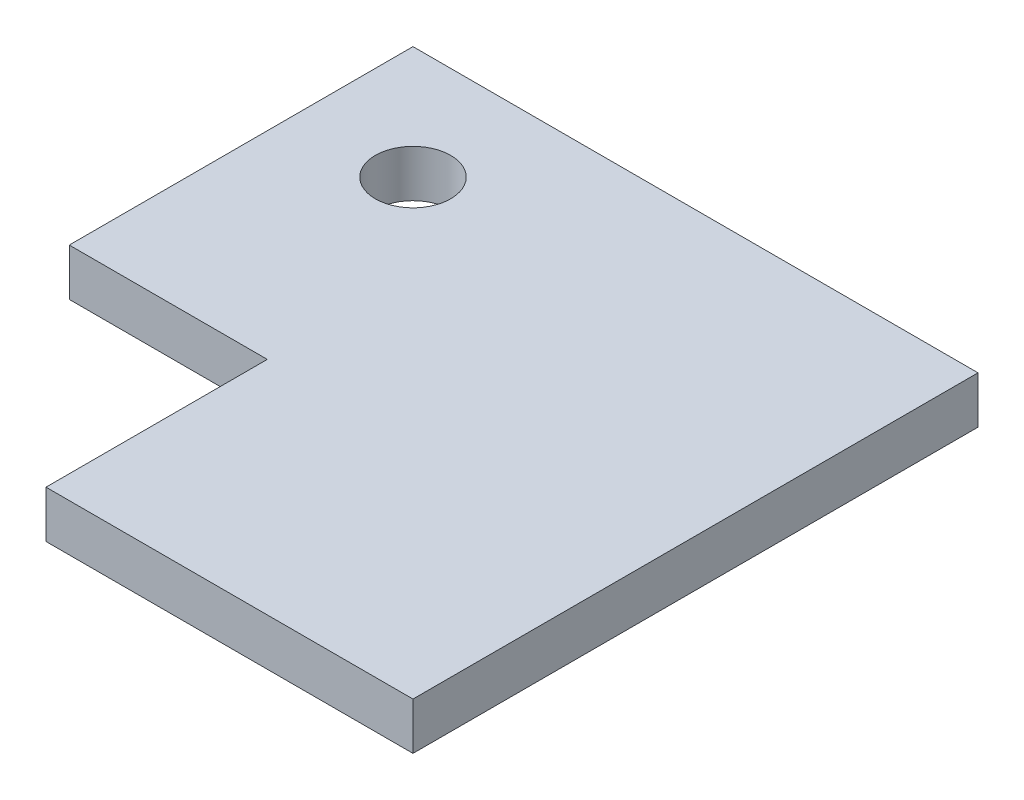
ISO-10303-21;
HEADER;
FILE_DESCRIPTION(('STEP AP214'),'2;1');
FILE_NAME('part.step','',(''),(''),'','','');
FILE_SCHEMA(('AUTOMOTIVE_DESIGN { 1 0 10303 214 1 1 1 1 }'));
ENDSEC;
DATA;
#1=APPLICATION_CONTEXT('core data for automotive mechanical design processes');
#2=APPLICATION_PROTOCOL_DEFINITION('international standard','automotive_design',2000,#1);
#3=PRODUCT_CONTEXT('',#1,'mechanical');
#4=PRODUCT('Part','Part','',(#3));
#5=PRODUCT_RELATED_PRODUCT_CATEGORY('part','',(#4));
#6=PRODUCT_DEFINITION_FORMATION('','',#4);
#7=PRODUCT_DEFINITION_CONTEXT('part definition',#1,'design');
#8=PRODUCT_DEFINITION('design','',#6,#7);
#9=PRODUCT_DEFINITION_SHAPE('','',#8);
#10=(LENGTH_UNIT() NAMED_UNIT(*) SI_UNIT(.MILLI.,.METRE.));
#11=(NAMED_UNIT(*) PLANE_ANGLE_UNIT() SI_UNIT($,.RADIAN.));
#12=(NAMED_UNIT(*) SI_UNIT($,.STERADIAN.) SOLID_ANGLE_UNIT());
#13=UNCERTAINTY_MEASURE_WITH_UNIT(LENGTH_MEASURE(1.E-05),#10,'distance_accuracy_value','');
#14=(GEOMETRIC_REPRESENTATION_CONTEXT(3) GLOBAL_UNCERTAINTY_ASSIGNED_CONTEXT((#13)) GLOBAL_UNIT_ASSIGNED_CONTEXT((#10,
#11,#12)) REPRESENTATION_CONTEXT('',''));
#15=CARTESIAN_POINT('',(0.,0.,0.));
#16=DIRECTION('',(0.,0.,1.));
#17=DIRECTION('',(1.,0.,0.));
#18=AXIS2_PLACEMENT_3D('',#15,#16,#17);
#19=CARTESIAN_POINT('',(0.,5.,0.));
#20=DIRECTION('',(0.,1.,0.));
#21=DIRECTION('',(0.,0.,1.));
#22=AXIS2_PLACEMENT_3D('',#19,#20,#21);
#23=PLANE('',#22);
#24=CARTESIAN_POINT('',(12.,5.,12.));
#25=DIRECTION('',(0.,1.,0.));
#26=DIRECTION('',(0.,0.,1.));
#27=AXIS2_PLACEMENT_3D('',#24,#25,#26);
#28=CIRCLE('',#27,4.);
#29=CARTESIAN_POINT('',(12.,5.,16.));
#30=VERTEX_POINT('',#29);
#31=EDGE_CURVE('E121',#30,#30,#28,.T.);
#32=ORIENTED_EDGE('',*,*,#31,.F.);
#33=EDGE_LOOP('',(#32));
#34=FACE_BOUND('',#33,.T.);
#35=DIRECTION('',(-1.,0.,0.));
#36=VECTOR('',#35,1.);
#37=CARTESIAN_POINT('',(0.,5.,36.5));
#38=LINE('',#37,#36);
#39=CARTESIAN_POINT('',(21.03,5.,36.5));
#40=VERTEX_POINT('',#39);
#41=CARTESIAN_POINT('',(0.,5.,36.5));
#42=VERTEX_POINT('',#41);
#43=EDGE_CURVE('E103',#40,#42,#38,.T.);
#44=ORIENTED_EDGE('',*,*,#43,.F.);
#45=DIRECTION('',(0.,0.,-1.));
#46=VECTOR('',#45,1.);
#47=CARTESIAN_POINT('',(21.03,5.,60.));
#48=LINE('',#47,#46);
#49=CARTESIAN_POINT('',(21.03,5.,60.));
#50=VERTEX_POINT('',#49);
#51=EDGE_CURVE('E95',#50,#40,#48,.T.);
#52=ORIENTED_EDGE('',*,*,#51,.F.);
#53=DIRECTION('',(1.,0.,0.));
#54=VECTOR('',#53,1.);
#55=CARTESIAN_POINT('',(0.,5.,60.));
#56=LINE('',#55,#54);
#57=CARTESIAN_POINT('',(60.,5.,60.));
#58=VERTEX_POINT('',#57);
#59=EDGE_CURVE('E79',#50,#58,#56,.T.);
#60=ORIENTED_EDGE('',*,*,#59,.T.);
#61=DIRECTION('',(0.,0.,-1.));
#62=VECTOR('',#61,1.);
#63=CARTESIAN_POINT('',(60.,5.,0.));
#64=LINE('',#63,#62);
#65=CARTESIAN_POINT('',(60.,5.,0.));
#66=VERTEX_POINT('',#65);
#67=EDGE_CURVE('E108',#58,#66,#64,.T.);
#68=ORIENTED_EDGE('',*,*,#67,.T.);
#69=DIRECTION('',(-1.,0.,0.));
#70=VECTOR('',#69,1.);
#71=CARTESIAN_POINT('',(0.,5.,0.));
#72=LINE('',#71,#70);
#73=CARTESIAN_POINT('',(0.,5.,0.));
#74=VERTEX_POINT('',#73);
#75=EDGE_CURVE('E57',#66,#74,#72,.T.);
#76=ORIENTED_EDGE('',*,*,#75,.T.);
#77=DIRECTION('',(0.,0.,1.));
#78=VECTOR('',#77,1.);
#79=CARTESIAN_POINT('',(0.,5.,0.));
#80=LINE('',#79,#78);
#81=EDGE_CURVE('E109',#74,#42,#80,.T.);
#82=ORIENTED_EDGE('',*,*,#81,.T.);
#83=EDGE_LOOP('',(#44,#52,#60,#68,#76,#82));
#84=FACE_BOUND('',#83,.T.);
#85=ADVANCED_FACE('F33',(#34,#84),#23,.T.);
#86=CARTESIAN_POINT('',(0.,0.,0.));
#87=DIRECTION('',(0.,1.,0.));
#88=DIRECTION('',(0.,0.,1.));
#89=AXIS2_PLACEMENT_3D('',#86,#87,#88);
#90=PLANE('',#89);
#91=CARTESIAN_POINT('',(12.,0.,12.));
#92=DIRECTION('',(0.,1.,0.));
#93=DIRECTION('',(0.,0.,1.));
#94=AXIS2_PLACEMENT_3D('',#91,#92,#93);
#95=CIRCLE('',#94,4.);
#96=CARTESIAN_POINT('',(12.,0.,16.));
#97=VERTEX_POINT('',#96);
#98=EDGE_CURVE('E99',#97,#97,#95,.T.);
#99=ORIENTED_EDGE('',*,*,#98,.T.);
#100=EDGE_LOOP('',(#99));
#101=FACE_BOUND('',#100,.T.);
#102=DIRECTION('',(0.,0.,-1.));
#103=VECTOR('',#102,1.);
#104=CARTESIAN_POINT('',(21.03,0.,60.));
#105=LINE('',#104,#103);
#106=CARTESIAN_POINT('',(21.03,0.,60.));
#107=VERTEX_POINT('',#106);
#108=CARTESIAN_POINT('',(21.03,0.,36.5));
#109=VERTEX_POINT('',#108);
#110=EDGE_CURVE('E48',#107,#109,#105,.T.);
#111=ORIENTED_EDGE('',*,*,#110,.T.);
#112=DIRECTION('',(-1.,0.,0.));
#113=VECTOR('',#112,1.);
#114=CARTESIAN_POINT('',(0.,0.,36.5));
#115=LINE('',#114,#113);
#116=CARTESIAN_POINT('',(0.,0.,36.5));
#117=VERTEX_POINT('',#116);
#118=EDGE_CURVE('E104',#109,#117,#115,.T.);
#119=ORIENTED_EDGE('',*,*,#118,.T.);
#120=DIRECTION('',(0.,0.,1.));
#121=VECTOR('',#120,1.);
#122=CARTESIAN_POINT('',(0.,0.,0.));
#123=LINE('',#122,#121);
#124=CARTESIAN_POINT('',(0.,0.,0.));
#125=VERTEX_POINT('',#124);
#126=EDGE_CURVE('E117',#125,#117,#123,.T.);
#127=ORIENTED_EDGE('',*,*,#126,.F.);
#128=DIRECTION('',(-1.,0.,0.));
#129=VECTOR('',#128,1.);
#130=CARTESIAN_POINT('',(0.,0.,0.));
#131=LINE('',#130,#129);
#132=CARTESIAN_POINT('',(60.,0.,0.));
#133=VERTEX_POINT('',#132);
#134=EDGE_CURVE('E74',#133,#125,#131,.T.);
#135=ORIENTED_EDGE('',*,*,#134,.F.);
#136=DIRECTION('',(0.,0.,-1.));
#137=VECTOR('',#136,1.);
#138=CARTESIAN_POINT('',(60.,0.,0.));
#139=LINE('',#138,#137);
#140=CARTESIAN_POINT('',(60.,0.,60.));
#141=VERTEX_POINT('',#140);
#142=EDGE_CURVE('E123',#141,#133,#139,.T.);
#143=ORIENTED_EDGE('',*,*,#142,.F.);
#144=DIRECTION('',(1.,0.,0.));
#145=VECTOR('',#144,1.);
#146=CARTESIAN_POINT('',(0.,0.,60.));
#147=LINE('',#146,#145);
#148=EDGE_CURVE('E120',#107,#141,#147,.T.);
#149=ORIENTED_EDGE('',*,*,#148,.F.);
#150=EDGE_LOOP('',(#111,#119,#127,#135,#143,#149));
#151=FACE_BOUND('',#150,.T.);
#152=ADVANCED_FACE('F132',(#101,#151),#90,.F.);
#153=CARTESIAN_POINT('',(0.,5.,0.));
#154=DIRECTION('',(1.,0.,0.));
#155=DIRECTION('',(0.,0.,-1.));
#156=AXIS2_PLACEMENT_3D('',#153,#154,#155);
#157=PLANE('',#156);
#158=DIRECTION('',(0.,-1.,0.));
#159=VECTOR('',#158,1.);
#160=CARTESIAN_POINT('',(0.,5.,36.5));
#161=LINE('',#160,#159);
#162=EDGE_CURVE('E138',#42,#117,#161,.T.);
#163=ORIENTED_EDGE('',*,*,#162,.F.);
#164=ORIENTED_EDGE('',*,*,#81,.F.);
#165=DIRECTION('',(0.,-1.,0.));
#166=VECTOR('',#165,1.);
#167=CARTESIAN_POINT('',(0.,5.,0.));
#168=LINE('',#167,#166);
#169=EDGE_CURVE('E116',#74,#125,#168,.T.);
#170=ORIENTED_EDGE('',*,*,#169,.T.);
#171=ORIENTED_EDGE('',*,*,#126,.T.);
#172=EDGE_LOOP('',(#163,#164,#170,#171));
#173=FACE_BOUND('',#172,.T.);
#174=ADVANCED_FACE('F35',(#173),#157,.F.);
#175=CARTESIAN_POINT('',(0.,5.,60.));
#176=DIRECTION('',(0.,0.,-1.));
#177=DIRECTION('',(-1.,0.,0.));
#178=AXIS2_PLACEMENT_3D('',#175,#176,#177);
#179=PLANE('',#178);
#180=DIRECTION('',(0.,-1.,0.));
#181=VECTOR('',#180,1.);
#182=CARTESIAN_POINT('',(21.03,5.,60.));
#183=LINE('',#182,#181);
#184=EDGE_CURVE('E93',#50,#107,#183,.T.);
#185=ORIENTED_EDGE('',*,*,#184,.T.);
#186=ORIENTED_EDGE('',*,*,#148,.T.);
#187=DIRECTION('',(0.,-1.,0.));
#188=VECTOR('',#187,1.);
#189=CARTESIAN_POINT('',(60.,5.,60.));
#190=LINE('',#189,#188);
#191=EDGE_CURVE('E11',#58,#141,#190,.T.);
#192=ORIENTED_EDGE('',*,*,#191,.F.);
#193=ORIENTED_EDGE('',*,*,#59,.F.);
#194=EDGE_LOOP('',(#185,#186,#192,#193));
#195=FACE_BOUND('',#194,.T.);
#196=ADVANCED_FACE('F106',(#195),#179,.F.);
#197=CARTESIAN_POINT('',(60.,5.,0.));
#198=DIRECTION('',(-1.,0.,0.));
#199=DIRECTION('',(0.,0.,1.));
#200=AXIS2_PLACEMENT_3D('',#197,#198,#199);
#201=PLANE('',#200);
#202=ORIENTED_EDGE('',*,*,#142,.T.);
#203=DIRECTION('',(0.,-1.,0.));
#204=VECTOR('',#203,1.);
#205=CARTESIAN_POINT('',(60.,5.,0.));
#206=LINE('',#205,#204);
#207=EDGE_CURVE('E41',#66,#133,#206,.T.);
#208=ORIENTED_EDGE('',*,*,#207,.F.);
#209=ORIENTED_EDGE('',*,*,#67,.F.);
#210=ORIENTED_EDGE('',*,*,#191,.T.);
#211=EDGE_LOOP('',(#202,#208,#209,#210));
#212=FACE_BOUND('',#211,.T.);
#213=ADVANCED_FACE('F162',(#212),#201,.F.);
#214=CARTESIAN_POINT('',(0.,5.,0.));
#215=DIRECTION('',(0.,0.,1.));
#216=DIRECTION('',(1.,0.,0.));
#217=AXIS2_PLACEMENT_3D('',#214,#215,#216);
#218=PLANE('',#217);
#219=ORIENTED_EDGE('',*,*,#134,.T.);
#220=ORIENTED_EDGE('',*,*,#169,.F.);
#221=ORIENTED_EDGE('',*,*,#75,.F.);
#222=ORIENTED_EDGE('',*,*,#207,.T.);
#223=EDGE_LOOP('',(#219,#220,#221,#222));
#224=FACE_BOUND('',#223,.T.);
#225=ADVANCED_FACE('F127',(#224),#218,.F.);
#226=CARTESIAN_POINT('',(12.,5.,12.));
#227=DIRECTION('',(0.,-1.,0.));
#228=DIRECTION('',(0.,0.,-1.));
#229=AXIS2_PLACEMENT_3D('',#226,#227,#228);
#230=CYLINDRICAL_SURFACE('',#229,4.);
#231=ORIENTED_EDGE('',*,*,#31,.T.);
#232=EDGE_LOOP('',(#231));
#233=FACE_BOUND('',#232,.T.);
#234=ORIENTED_EDGE('',*,*,#98,.F.);
#235=EDGE_LOOP('',(#234));
#236=FACE_BOUND('',#235,.T.);
#237=ADVANCED_FACE('F151',(#233,#236),#230,.F.);
#238=CARTESIAN_POINT('',(21.03,5.,60.));
#239=DIRECTION('',(-1.,0.,0.));
#240=DIRECTION('',(0.,0.,1.));
#241=AXIS2_PLACEMENT_3D('',#238,#239,#240);
#242=PLANE('',#241);
#243=ORIENTED_EDGE('',*,*,#110,.F.);
#244=ORIENTED_EDGE('',*,*,#184,.F.);
#245=ORIENTED_EDGE('',*,*,#51,.T.);
#246=DIRECTION('',(0.,-1.,0.));
#247=VECTOR('',#246,1.);
#248=CARTESIAN_POINT('',(21.03,5.,36.5));
#249=LINE('',#248,#247);
#250=EDGE_CURVE('E100',#40,#109,#249,.T.);
#251=ORIENTED_EDGE('',*,*,#250,.T.);
#252=EDGE_LOOP('',(#243,#244,#245,#251));
#253=FACE_BOUND('',#252,.T.);
#254=ADVANCED_FACE('F94',(#253),#242,.T.);
#255=CARTESIAN_POINT('',(0.,5.,36.5));
#256=DIRECTION('',(0.,0.,1.));
#257=DIRECTION('',(1.,0.,0.));
#258=AXIS2_PLACEMENT_3D('',#255,#256,#257);
#259=PLANE('',#258);
#260=ORIENTED_EDGE('',*,*,#118,.F.);
#261=ORIENTED_EDGE('',*,*,#250,.F.);
#262=ORIENTED_EDGE('',*,*,#43,.T.);
#263=ORIENTED_EDGE('',*,*,#162,.T.);
#264=EDGE_LOOP('',(#260,#261,#262,#263));
#265=FACE_BOUND('',#264,.T.);
#266=ADVANCED_FACE('F160',(#265),#259,.T.);
#267=CLOSED_SHELL('',(#85,#152,#174,#196,#213,#225,#237,#254,#266));
#268=MANIFOLD_SOLID_BREP('B2',#267);
#269=ADVANCED_BREP_SHAPE_REPRESENTATION('',(#18,#268),#14);
#270=SHAPE_DEFINITION_REPRESENTATION(#9,#269);
ENDSEC;
END-ISO-10303-21;
